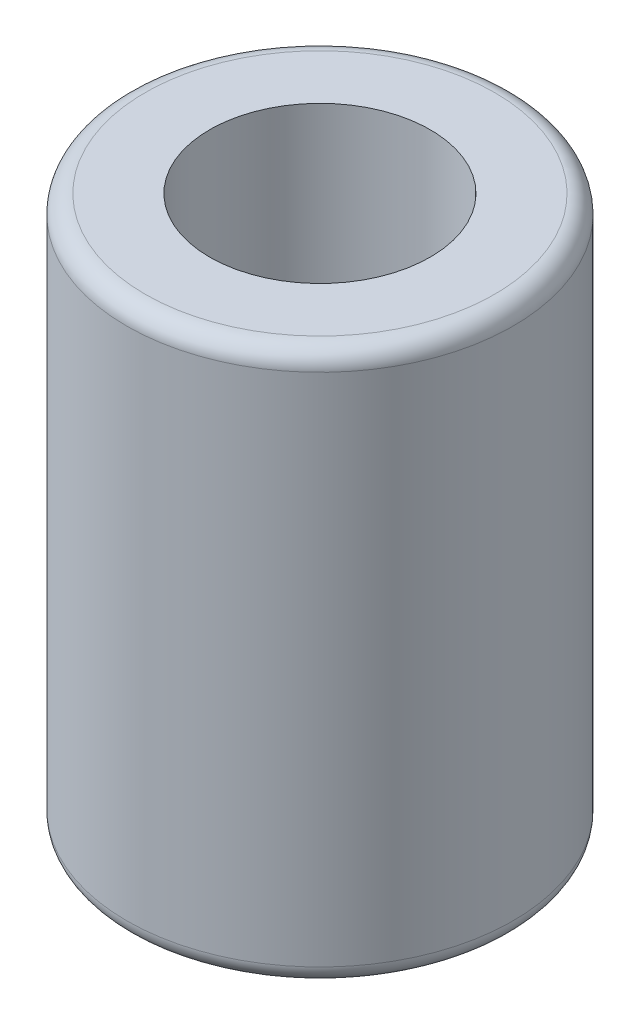
ISO-10303-21;
HEADER;
FILE_DESCRIPTION(('STEP AP214'),'2;1');
FILE_NAME('part.step','',(''),(''),'','','');
FILE_SCHEMA(('AUTOMOTIVE_DESIGN { 1 0 10303 214 1 1 1 1 }'));
ENDSEC;
DATA;
#1=APPLICATION_CONTEXT('core data for automotive mechanical design processes');
#2=APPLICATION_PROTOCOL_DEFINITION('international standard','automotive_design',2000,#1);
#3=PRODUCT_CONTEXT('',#1,'mechanical');
#4=PRODUCT('Part','Part','',(#3));
#5=PRODUCT_RELATED_PRODUCT_CATEGORY('part','',(#4));
#6=PRODUCT_DEFINITION_FORMATION('','',#4);
#7=PRODUCT_DEFINITION_CONTEXT('part definition',#1,'design');
#8=PRODUCT_DEFINITION('design','',#6,#7);
#9=PRODUCT_DEFINITION_SHAPE('','',#8);
#10=(LENGTH_UNIT() NAMED_UNIT(*) SI_UNIT(.MILLI.,.METRE.));
#11=(NAMED_UNIT(*) PLANE_ANGLE_UNIT() SI_UNIT($,.RADIAN.));
#12=(NAMED_UNIT(*) SI_UNIT($,.STERADIAN.) SOLID_ANGLE_UNIT());
#13=UNCERTAINTY_MEASURE_WITH_UNIT(LENGTH_MEASURE(1.E-05),#10,'distance_accuracy_value','');
#14=(GEOMETRIC_REPRESENTATION_CONTEXT(3) GLOBAL_UNCERTAINTY_ASSIGNED_CONTEXT((#13)) GLOBAL_UNIT_ASSIGNED_CONTEXT((#10,
#11,#12)) REPRESENTATION_CONTEXT('',''));
#15=CARTESIAN_POINT('',(0.,0.,0.));
#16=DIRECTION('',(0.,0.,1.));
#17=DIRECTION('',(1.,0.,0.));
#18=AXIS2_PLACEMENT_3D('',#15,#16,#17);
#19=CARTESIAN_POINT('',(0.,30.,0.));
#20=DIRECTION('',(0.,1.,0.));
#21=DIRECTION('',(0.,0.,1.));
#22=AXIS2_PLACEMENT_3D('',#19,#20,#21);
#23=PLANE('',#22);
#24=CARTESIAN_POINT('',(0.,30.,0.));
#25=DIRECTION('',(0.,1.,0.));
#26=DIRECTION('',(0.,0.,1.));
#27=AXIS2_PLACEMENT_3D('',#24,#25,#26);
#28=CIRCLE('',#27,9.5);
#29=CARTESIAN_POINT('',(0.,30.,9.5));
#30=VERTEX_POINT('',#29);
#31=EDGE_CURVE('E10',#30,#30,#28,.T.);
#32=ORIENTED_EDGE('',*,*,#31,.T.);
#33=EDGE_LOOP('',(#32));
#34=FACE_BOUND('',#33,.T.);
#35=CARTESIAN_POINT('',(0.,30.,0.));
#36=DIRECTION('',(0.,1.,0.));
#37=DIRECTION('',(0.,0.,1.));
#38=AXIS2_PLACEMENT_3D('',#35,#36,#37);
#39=CIRCLE('',#38,6.);
#40=CARTESIAN_POINT('',(0.,30.,6.));
#41=VERTEX_POINT('',#40);
#42=EDGE_CURVE('E50',#41,#41,#39,.T.);
#43=ORIENTED_EDGE('',*,*,#42,.F.);
#44=EDGE_LOOP('',(#43));
#45=FACE_BOUND('',#44,.T.);
#46=ADVANCED_FACE('F30',(#34,#45),#23,.T.);
#47=CARTESIAN_POINT('',(0.,0.,0.));
#48=DIRECTION('',(0.,1.,0.));
#49=DIRECTION('',(0.,0.,1.));
#50=AXIS2_PLACEMENT_3D('',#47,#48,#49);
#51=PLANE('',#50);
#52=CARTESIAN_POINT('',(0.,0.,0.));
#53=DIRECTION('',(0.,1.,0.));
#54=DIRECTION('',(0.,0.,1.));
#55=AXIS2_PLACEMENT_3D('',#52,#53,#54);
#56=CIRCLE('',#55,9.5);
#57=CARTESIAN_POINT('',(0.,0.,9.5));
#58=VERTEX_POINT('',#57);
#59=EDGE_CURVE('E37',#58,#58,#56,.F.);
#60=ORIENTED_EDGE('',*,*,#59,.T.);
#61=EDGE_LOOP('',(#60));
#62=FACE_BOUND('',#61,.T.);
#63=CARTESIAN_POINT('',(0.,0.,0.));
#64=DIRECTION('',(0.,1.,0.));
#65=DIRECTION('',(0.,0.,1.));
#66=AXIS2_PLACEMENT_3D('',#63,#64,#65);
#67=CIRCLE('',#66,6.);
#68=CARTESIAN_POINT('',(0.,0.,6.));
#69=VERTEX_POINT('',#68);
#70=EDGE_CURVE('E51',#69,#69,#67,.T.);
#71=ORIENTED_EDGE('',*,*,#70,.T.);
#72=EDGE_LOOP('',(#71));
#73=FACE_BOUND('',#72,.T.);
#74=ADVANCED_FACE('F61',(#62,#73),#51,.F.);
#75=CARTESIAN_POINT('',(0.,30.,0.));
#76=DIRECTION('',(0.,-1.,0.));
#77=DIRECTION('',(0.,0.,-1.));
#78=AXIS2_PLACEMENT_3D('',#75,#76,#77);
#79=CYLINDRICAL_SURFACE('',#78,10.5);
#80=CARTESIAN_POINT('',(0.,1.,0.));
#81=DIRECTION('',(0.,1.,0.));
#82=DIRECTION('',(0.,0.,1.));
#83=AXIS2_PLACEMENT_3D('',#80,#81,#82);
#84=CIRCLE('',#83,10.5);
#85=CARTESIAN_POINT('',(0.,1.,10.5));
#86=VERTEX_POINT('',#85);
#87=EDGE_CURVE('E41',#86,#86,#84,.T.);
#88=ORIENTED_EDGE('',*,*,#87,.T.);
#89=EDGE_LOOP('',(#88));
#90=FACE_BOUND('',#89,.T.);
#91=CARTESIAN_POINT('',(0.,29.,0.));
#92=DIRECTION('',(0.,1.,0.));
#93=DIRECTION('',(0.,0.,1.));
#94=AXIS2_PLACEMENT_3D('',#91,#92,#93);
#95=CIRCLE('',#94,10.5);
#96=CARTESIAN_POINT('',(0.,29.,10.5));
#97=VERTEX_POINT('',#96);
#98=EDGE_CURVE('E45',#97,#97,#95,.F.);
#99=ORIENTED_EDGE('',*,*,#98,.T.);
#100=EDGE_LOOP('',(#99));
#101=FACE_BOUND('',#100,.T.);
#102=ADVANCED_FACE('F66',(#90,#101),#79,.T.);
#103=CARTESIAN_POINT('',(0.,30.,0.));
#104=DIRECTION('',(0.,-1.,0.));
#105=DIRECTION('',(0.,0.,-1.));
#106=AXIS2_PLACEMENT_3D('',#103,#104,#105);
#107=CYLINDRICAL_SURFACE('',#106,6.);
#108=ORIENTED_EDGE('',*,*,#42,.T.);
#109=EDGE_LOOP('',(#108));
#110=FACE_BOUND('',#109,.T.);
#111=ORIENTED_EDGE('',*,*,#70,.F.);
#112=EDGE_LOOP('',(#111));
#113=FACE_BOUND('',#112,.T.);
#114=ADVANCED_FACE('F57',(#110,#113),#107,.F.);
#115=CARTESIAN_POINT('',(0.,1.,0.));
#116=DIRECTION('',(0.,1.,0.));
#117=DIRECTION('',(0.,0.,1.));
#118=AXIS2_PLACEMENT_3D('',#115,#116,#117);
#119=TOROIDAL_SURFACE('',#118,9.5,1.);
#120=ORIENTED_EDGE('',*,*,#59,.F.);
#121=EDGE_LOOP('',(#120));
#122=FACE_BOUND('',#121,.T.);
#123=ORIENTED_EDGE('',*,*,#87,.F.);
#124=EDGE_LOOP('',(#123));
#125=FACE_BOUND('',#124,.T.);
#126=ADVANCED_FACE('F72',(#122,#125),#119,.T.);
#127=CARTESIAN_POINT('',(0.,29.,0.));
#128=DIRECTION('',(0.,1.,0.));
#129=DIRECTION('',(0.,0.,1.));
#130=AXIS2_PLACEMENT_3D('',#127,#128,#129);
#131=TOROIDAL_SURFACE('',#130,9.5,1.);
#132=ORIENTED_EDGE('',*,*,#98,.F.);
#133=EDGE_LOOP('',(#132));
#134=FACE_BOUND('',#133,.T.);
#135=ORIENTED_EDGE('',*,*,#31,.F.);
#136=EDGE_LOOP('',(#135));
#137=FACE_BOUND('',#136,.T.);
#138=ADVANCED_FACE('F32',(#134,#137),#131,.T.);
#139=CLOSED_SHELL('',(#46,#74,#102,#114,#126,#138));
#140=MANIFOLD_SOLID_BREP('B2',#139);
#141=ADVANCED_BREP_SHAPE_REPRESENTATION('',(#18,#140),#14);
#142=SHAPE_DEFINITION_REPRESENTATION(#9,#141);
ENDSEC;
END-ISO-10303-21;
